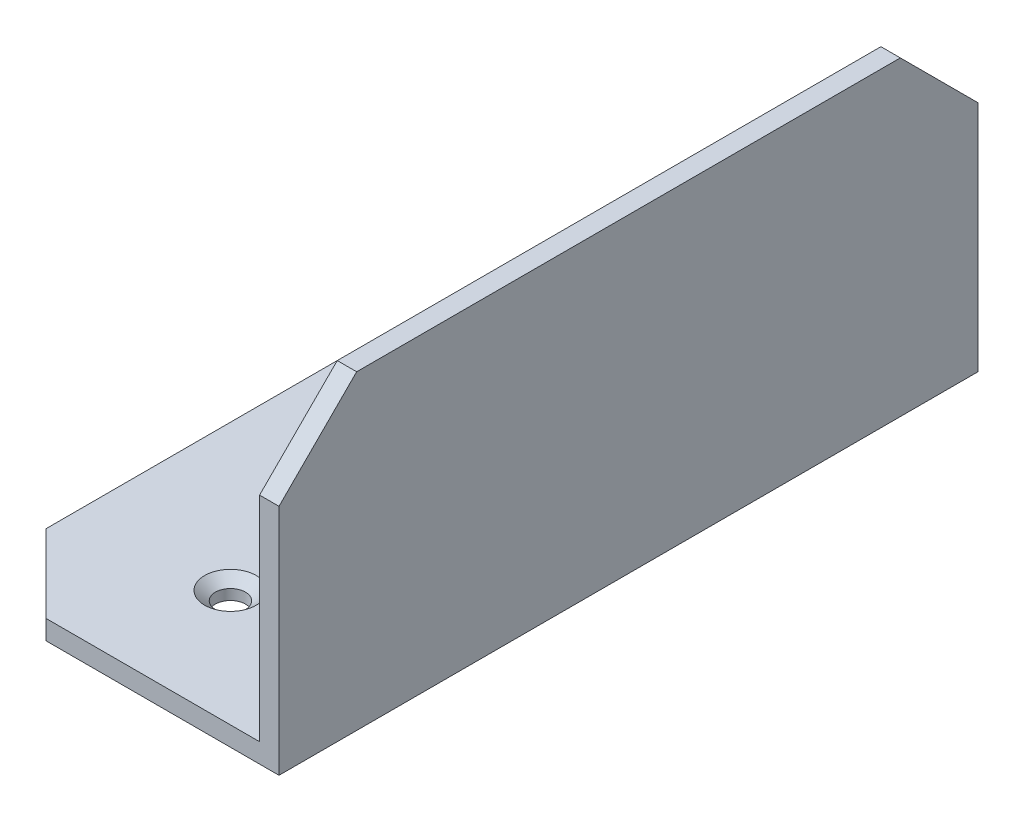
ISO-10303-21;
HEADER;
FILE_DESCRIPTION(('STEP AP214'),'2;1');
FILE_NAME('part.step','',(''),(''),'','','');
FILE_SCHEMA(('AUTOMOTIVE_DESIGN { 1 0 10303 214 1 1 1 1 }'));
ENDSEC;
DATA;
#1=APPLICATION_CONTEXT('core data for automotive mechanical design processes');
#2=APPLICATION_PROTOCOL_DEFINITION('international standard','automotive_design',2000,#1);
#3=PRODUCT_CONTEXT('',#1,'mechanical');
#4=PRODUCT('Part','Part','',(#3));
#5=PRODUCT_RELATED_PRODUCT_CATEGORY('part','',(#4));
#6=PRODUCT_DEFINITION_FORMATION('','',#4);
#7=PRODUCT_DEFINITION_CONTEXT('part definition',#1,'design');
#8=PRODUCT_DEFINITION('design','',#6,#7);
#9=PRODUCT_DEFINITION_SHAPE('','',#8);
#10=(LENGTH_UNIT() NAMED_UNIT(*) SI_UNIT(.MILLI.,.METRE.));
#11=(NAMED_UNIT(*) PLANE_ANGLE_UNIT() SI_UNIT($,.RADIAN.));
#12=(NAMED_UNIT(*) SI_UNIT($,.STERADIAN.) SOLID_ANGLE_UNIT());
#13=UNCERTAINTY_MEASURE_WITH_UNIT(LENGTH_MEASURE(1.E-05),#10,'distance_accuracy_value','');
#14=(GEOMETRIC_REPRESENTATION_CONTEXT(3) GLOBAL_UNCERTAINTY_ASSIGNED_CONTEXT((#13)) GLOBAL_UNIT_ASSIGNED_CONTEXT((#10,
#11,#12)) REPRESENTATION_CONTEXT('',''));
#15=CARTESIAN_POINT('',(0.,0.,0.));
#16=DIRECTION('',(0.,0.,1.));
#17=DIRECTION('',(1.,0.,0.));
#18=AXIS2_PLACEMENT_3D('',#15,#16,#17);
#19=CARTESIAN_POINT('',(0.,0.,-114.3));
#20=DIRECTION('',(0.,-1.,0.));
#21=DIRECTION('',(0.,0.,-1.));
#22=AXIS2_PLACEMENT_3D('',#19,#20,#21);
#23=PLANE('',#22);
#24=CARTESIAN_POINT('',(-26.9875,0.,-19.05));
#25=DIRECTION('',(0.,1.,0.));
#26=DIRECTION('',(0.,0.,1.));
#27=AXIS2_PLACEMENT_3D('',#24,#25,#26);
#28=CIRCLE('',#27,2.45745);
#29=CARTESIAN_POINT('',(-26.9875,0.,-16.59255));
#30=VERTEX_POINT('',#29);
#31=EDGE_CURVE('E385',#30,#30,#28,.T.);
#32=ORIENTED_EDGE('',*,*,#31,.T.);
#33=EDGE_LOOP('',(#32));
#34=FACE_BOUND('',#33,.T.);
#35=CARTESIAN_POINT('',(-26.9875,0.,-57.15));
#36=DIRECTION('',(0.,1.,0.));
#37=DIRECTION('',(0.,0.,1.));
#38=AXIS2_PLACEMENT_3D('',#35,#36,#37);
#39=CIRCLE('',#38,2.45745);
#40=CARTESIAN_POINT('',(-26.9875,0.,-54.69255));
#41=VERTEX_POINT('',#40);
#42=EDGE_CURVE('E395',#41,#41,#39,.T.);
#43=ORIENTED_EDGE('',*,*,#42,.T.);
#44=EDGE_LOOP('',(#43));
#45=FACE_BOUND('',#44,.T.);
#46=CARTESIAN_POINT('',(-26.9875,0.,-95.25));
#47=DIRECTION('',(0.,1.,0.));
#48=DIRECTION('',(0.,0.,1.));
#49=AXIS2_PLACEMENT_3D('',#46,#47,#48);
#50=CIRCLE('',#49,2.45745);
#51=CARTESIAN_POINT('',(-26.9875,0.,-92.79255));
#52=VERTEX_POINT('',#51);
#53=EDGE_CURVE('E150',#52,#52,#50,.T.);
#54=ORIENTED_EDGE('',*,*,#53,.T.);
#55=EDGE_LOOP('',(#54));
#56=FACE_BOUND('',#55,.T.);
#57=DIRECTION('',(0.,0.,1.));
#58=VECTOR('',#57,1.);
#59=CARTESIAN_POINT('',(-50.8,0.,-114.3));
#60=LINE('',#59,#58);
#61=CARTESIAN_POINT('',(-50.8,0.,-101.6));
#62=VERTEX_POINT('',#61);
#63=CARTESIAN_POINT('',(-50.8,0.,-12.7000000000001));
#64=VERTEX_POINT('',#63);
#65=EDGE_CURVE('E156',#62,#64,#60,.T.);
#66=ORIENTED_EDGE('',*,*,#65,.F.);
#67=DIRECTION('',(-0.707106781186549,0.,0.707106781186546));
#68=VECTOR('',#67,1.);
#69=CARTESIAN_POINT('',(-19.0499999999999,0.,-133.35));
#70=LINE('',#69,#68);
#71=CARTESIAN_POINT('',(-38.0999999999999,0.,-114.3));
#72=VERTEX_POINT('',#71);
#73=EDGE_CURVE('E123',#62,#72,#70,.F.);
#74=ORIENTED_EDGE('',*,*,#73,.T.);
#75=DIRECTION('',(1.,0.,0.));
#76=VECTOR('',#75,1.);
#77=CARTESIAN_POINT('',(0.,0.,-114.3));
#78=LINE('',#77,#76);
#79=CARTESIAN_POINT('',(0.,0.,-114.3));
#80=VERTEX_POINT('',#79);
#81=EDGE_CURVE('E118',#72,#80,#78,.T.);
#82=ORIENTED_EDGE('',*,*,#81,.T.);
#83=DIRECTION('',(0.,0.,1.));
#84=VECTOR('',#83,1.);
#85=CARTESIAN_POINT('',(0.,0.,-114.3));
#86=LINE('',#85,#84);
#87=CARTESIAN_POINT('',(0.,0.,0.));
#88=VERTEX_POINT('',#87);
#89=EDGE_CURVE('E122',#80,#88,#86,.T.);
#90=ORIENTED_EDGE('',*,*,#89,.T.);
#91=DIRECTION('',(1.,0.,0.));
#92=VECTOR('',#91,1.);
#93=CARTESIAN_POINT('',(0.,0.,0.));
#94=LINE('',#93,#92);
#95=CARTESIAN_POINT('',(-38.1,0.,0.));
#96=VERTEX_POINT('',#95);
#97=EDGE_CURVE('E148',#96,#88,#94,.T.);
#98=ORIENTED_EDGE('',*,*,#97,.F.);
#99=DIRECTION('',(-0.707106781186546,0.,-0.707106781186549));
#100=VECTOR('',#99,1.);
#101=CARTESIAN_POINT('',(-76.2000000000001,0.,-38.1000000000002));
#102=LINE('',#101,#100);
#103=EDGE_CURVE('E174',#96,#64,#102,.T.);
#104=ORIENTED_EDGE('',*,*,#103,.T.);
#105=EDGE_LOOP('',(#66,#74,#82,#90,#98,#104));
#106=FACE_BOUND('',#105,.T.);
#107=ADVANCED_FACE('F38',(#34,#45,#56,#106),#23,.T.);
#108=CARTESIAN_POINT('',(-50.8,0.,-114.3));
#109=DIRECTION('',(-1.,0.,0.));
#110=DIRECTION('',(0.,0.,1.));
#111=AXIS2_PLACEMENT_3D('',#108,#109,#110);
#112=PLANE('',#111);
#113=DIRECTION('',(0.,0.,1.));
#114=VECTOR('',#113,1.);
#115=CARTESIAN_POINT('',(-50.8,3.175,-114.3));
#116=LINE('',#115,#114);
#117=CARTESIAN_POINT('',(-50.8,3.175,-101.6));
#118=VERTEX_POINT('',#117);
#119=CARTESIAN_POINT('',(-50.8,3.175,-12.7000000000001));
#120=VERTEX_POINT('',#119);
#121=EDGE_CURVE('E160',#118,#120,#116,.T.);
#122=ORIENTED_EDGE('',*,*,#121,.F.);
#123=DIRECTION('',(0.,-1.,0.));
#124=VECTOR('',#123,1.);
#125=CARTESIAN_POINT('',(-50.8,0.,-101.6));
#126=LINE('',#125,#124);
#127=EDGE_CURVE('E171',#118,#62,#126,.T.);
#128=ORIENTED_EDGE('',*,*,#127,.T.);
#129=ORIENTED_EDGE('',*,*,#65,.T.);
#130=DIRECTION('',(0.,1.,0.));
#131=VECTOR('',#130,1.);
#132=CARTESIAN_POINT('',(-50.8,3.175,-12.7000000000001));
#133=LINE('',#132,#131);
#134=EDGE_CURVE('E159',#64,#120,#133,.T.);
#135=ORIENTED_EDGE('',*,*,#134,.T.);
#136=EDGE_LOOP('',(#122,#128,#129,#135));
#137=FACE_BOUND('',#136,.T.);
#138=ADVANCED_FACE('F204',(#137),#112,.T.);
#139=CARTESIAN_POINT('',(-3.175,3.175,-114.3));
#140=DIRECTION('',(0.,1.,0.));
#141=DIRECTION('',(0.,0.,1.));
#142=AXIS2_PLACEMENT_3D('',#139,#140,#141);
#143=PLANE('',#142);
#144=CARTESIAN_POINT('',(-26.9875,3.175,-19.05));
#145=DIRECTION('',(0.,1.,0.));
#146=DIRECTION('',(0.,0.,1.));
#147=AXIS2_PLACEMENT_3D('',#144,#145,#146);
#148=CIRCLE('',#147,4.2164);
#149=CARTESIAN_POINT('',(-26.9875,3.175,-14.8336));
#150=VERTEX_POINT('',#149);
#151=EDGE_CURVE('E383',#150,#150,#148,.T.);
#152=ORIENTED_EDGE('',*,*,#151,.F.);
#153=EDGE_LOOP('',(#152));
#154=FACE_BOUND('',#153,.T.);
#155=CARTESIAN_POINT('',(-26.9875,3.175,-57.15));
#156=DIRECTION('',(0.,1.,0.));
#157=DIRECTION('',(0.,0.,1.));
#158=AXIS2_PLACEMENT_3D('',#155,#156,#157);
#159=CIRCLE('',#158,4.2164);
#160=CARTESIAN_POINT('',(-26.9875,3.175,-52.9336));
#161=VERTEX_POINT('',#160);
#162=EDGE_CURVE('E389',#161,#161,#159,.T.);
#163=ORIENTED_EDGE('',*,*,#162,.F.);
#164=EDGE_LOOP('',(#163));
#165=FACE_BOUND('',#164,.T.);
#166=CARTESIAN_POINT('',(-26.9875,3.175,-95.25));
#167=DIRECTION('',(0.,1.,0.));
#168=DIRECTION('',(0.,0.,1.));
#169=AXIS2_PLACEMENT_3D('',#166,#167,#168);
#170=CIRCLE('',#169,4.2164);
#171=CARTESIAN_POINT('',(-26.9875,3.175,-91.0336));
#172=VERTEX_POINT('',#171);
#173=EDGE_CURVE('E398',#172,#172,#170,.T.);
#174=ORIENTED_EDGE('',*,*,#173,.F.);
#175=EDGE_LOOP('',(#174));
#176=FACE_BOUND('',#175,.T.);
#177=DIRECTION('',(-1.,0.,0.));
#178=VECTOR('',#177,1.);
#179=CARTESIAN_POINT('',(-3.175,3.175,-114.3));
#180=LINE('',#179,#178);
#181=CARTESIAN_POINT('',(-3.175,3.175,-114.3));
#182=VERTEX_POINT('',#181);
#183=CARTESIAN_POINT('',(-38.0999999999999,3.175,-114.3));
#184=VERTEX_POINT('',#183);
#185=EDGE_CURVE('E135',#182,#184,#180,.T.);
#186=ORIENTED_EDGE('',*,*,#185,.T.);
#187=DIRECTION('',(0.707106781186549,0.,-0.707106781186546));
#188=VECTOR('',#187,1.);
#189=CARTESIAN_POINT('',(-20.6374999999999,3.175,-131.7625));
#190=LINE('',#189,#188);
#191=EDGE_CURVE('E182',#184,#118,#190,.F.);
#192=ORIENTED_EDGE('',*,*,#191,.T.);
#193=ORIENTED_EDGE('',*,*,#121,.T.);
#194=DIRECTION('',(0.707106781186546,0.,0.707106781186549));
#195=VECTOR('',#194,1.);
#196=CARTESIAN_POINT('',(-77.7875000000001,3.175,-39.6875000000002));
#197=LINE('',#196,#195);
#198=CARTESIAN_POINT('',(-38.1,3.175,0.));
#199=VERTEX_POINT('',#198);
#200=EDGE_CURVE('E180',#120,#199,#197,.T.);
#201=ORIENTED_EDGE('',*,*,#200,.T.);
#202=DIRECTION('',(-1.,0.,0.));
#203=VECTOR('',#202,1.);
#204=CARTESIAN_POINT('',(-3.175,3.175,0.));
#205=LINE('',#204,#203);
#206=CARTESIAN_POINT('',(-3.175,3.175,0.));
#207=VERTEX_POINT('',#206);
#208=EDGE_CURVE('E128',#207,#199,#205,.T.);
#209=ORIENTED_EDGE('',*,*,#208,.F.);
#210=DIRECTION('',(0.,0.,1.));
#211=VECTOR('',#210,1.);
#212=CARTESIAN_POINT('',(-3.175,3.175,-114.3));
#213=LINE('',#212,#211);
#214=EDGE_CURVE('E163',#182,#207,#213,.T.);
#215=ORIENTED_EDGE('',*,*,#214,.F.);
#216=EDGE_LOOP('',(#186,#192,#193,#201,#209,#215));
#217=FACE_BOUND('',#216,.T.);
#218=ADVANCED_FACE('F207',(#154,#165,#176,#217),#143,.T.);
#219=CARTESIAN_POINT('',(-3.175,3.175,-114.3));
#220=DIRECTION('',(-1.,0.,0.));
#221=DIRECTION('',(0.,0.,1.));
#222=AXIS2_PLACEMENT_3D('',#219,#220,#221);
#223=PLANE('',#222);
#224=DIRECTION('',(0.,0.,1.));
#225=VECTOR('',#224,1.);
#226=CARTESIAN_POINT('',(-3.175,50.8,-114.3));
#227=LINE('',#226,#225);
#228=CARTESIAN_POINT('',(-3.175,50.8,-101.6));
#229=VERTEX_POINT('',#228);
#230=CARTESIAN_POINT('',(-3.175,50.8,-12.7000000000001));
#231=VERTEX_POINT('',#230);
#232=EDGE_CURVE('E166',#229,#231,#227,.T.);
#233=ORIENTED_EDGE('',*,*,#232,.F.);
#234=DIRECTION('',(0.,0.707106781186549,0.707106781186546));
#235=VECTOR('',#234,1.);
#236=CARTESIAN_POINT('',(-3.175,20.6374999999999,-131.7625));
#237=LINE('',#236,#235);
#238=CARTESIAN_POINT('',(-3.175,38.0999999999999,-114.3));
#239=VERTEX_POINT('',#238);
#240=EDGE_CURVE('E190',#229,#239,#237,.F.);
#241=ORIENTED_EDGE('',*,*,#240,.T.);
#242=DIRECTION('',(0.,-1.,0.));
#243=VECTOR('',#242,1.);
#244=CARTESIAN_POINT('',(-3.175,3.175,-114.3));
#245=LINE('',#244,#243);
#246=EDGE_CURVE('E141',#239,#182,#245,.T.);
#247=ORIENTED_EDGE('',*,*,#246,.T.);
#248=ORIENTED_EDGE('',*,*,#214,.T.);
#249=DIRECTION('',(0.,-1.,0.));
#250=VECTOR('',#249,1.);
#251=CARTESIAN_POINT('',(-3.175,3.175,0.));
#252=LINE('',#251,#250);
#253=CARTESIAN_POINT('',(-3.175,38.1,0.));
#254=VERTEX_POINT('',#253);
#255=EDGE_CURVE('E152',#254,#207,#252,.T.);
#256=ORIENTED_EDGE('',*,*,#255,.F.);
#257=DIRECTION('',(0.,0.707106781186546,-0.707106781186549));
#258=VECTOR('',#257,1.);
#259=CARTESIAN_POINT('',(-3.175,77.7875000000001,-39.6875000000002));
#260=LINE('',#259,#258);
#261=EDGE_CURVE('E62',#254,#231,#260,.T.);
#262=ORIENTED_EDGE('',*,*,#261,.T.);
#263=EDGE_LOOP('',(#233,#241,#247,#248,#256,#262));
#264=FACE_BOUND('',#263,.T.);
#265=ADVANCED_FACE('F216',(#264),#223,.T.);
#266=CARTESIAN_POINT('',(0.,50.8,-114.3));
#267=DIRECTION('',(0.,1.,0.));
#268=DIRECTION('',(0.,0.,1.));
#269=AXIS2_PLACEMENT_3D('',#266,#267,#268);
#270=PLANE('',#269);
#271=DIRECTION('',(0.,0.,1.));
#272=VECTOR('',#271,1.);
#273=CARTESIAN_POINT('',(0.,50.8,-114.3));
#274=LINE('',#273,#272);
#275=CARTESIAN_POINT('',(0.,50.8,-101.6));
#276=VERTEX_POINT('',#275);
#277=CARTESIAN_POINT('',(0.,50.8,-12.7000000000001));
#278=VERTEX_POINT('',#277);
#279=EDGE_CURVE('E134',#276,#278,#274,.T.);
#280=ORIENTED_EDGE('',*,*,#279,.F.);
#281=DIRECTION('',(-1.,0.,0.));
#282=VECTOR('',#281,1.);
#283=CARTESIAN_POINT('',(0.,50.8,-101.6));
#284=LINE('',#283,#282);
#285=EDGE_CURVE('E186',#276,#229,#284,.T.);
#286=ORIENTED_EDGE('',*,*,#285,.T.);
#287=ORIENTED_EDGE('',*,*,#232,.T.);
#288=DIRECTION('',(1.,0.,0.));
#289=VECTOR('',#288,1.);
#290=CARTESIAN_POINT('',(0.,50.8,-12.7000000000001));
#291=LINE('',#290,#289);
#292=EDGE_CURVE('E184',#231,#278,#291,.T.);
#293=ORIENTED_EDGE('',*,*,#292,.T.);
#294=EDGE_LOOP('',(#280,#286,#287,#293));
#295=FACE_BOUND('',#294,.T.);
#296=ADVANCED_FACE('F222',(#295),#270,.T.);
#297=CARTESIAN_POINT('',(0.,0.,-114.3));
#298=DIRECTION('',(1.,0.,0.));
#299=DIRECTION('',(0.,1.,0.));
#300=AXIS2_PLACEMENT_3D('',#297,#298,#299);
#301=PLANE('',#300);
#302=DIRECTION('',(0.,1.,0.));
#303=VECTOR('',#302,1.);
#304=CARTESIAN_POINT('',(0.,0.,-114.3));
#305=LINE('',#304,#303);
#306=CARTESIAN_POINT('',(0.,38.0999999999999,-114.3));
#307=VERTEX_POINT('',#306);
#308=EDGE_CURVE('E127',#80,#307,#305,.T.);
#309=ORIENTED_EDGE('',*,*,#308,.T.);
#310=DIRECTION('',(0.,-0.707106781186549,-0.707106781186546));
#311=VECTOR('',#310,1.);
#312=CARTESIAN_POINT('',(0.,19.0499999999999,-133.35));
#313=LINE('',#312,#311);
#314=EDGE_CURVE('E193',#307,#276,#313,.F.);
#315=ORIENTED_EDGE('',*,*,#314,.T.);
#316=ORIENTED_EDGE('',*,*,#279,.T.);
#317=DIRECTION('',(0.,-0.707106781186546,0.707106781186549));
#318=VECTOR('',#317,1.);
#319=CARTESIAN_POINT('',(0.,76.2000000000001,-38.1000000000002));
#320=LINE('',#319,#318);
#321=CARTESIAN_POINT('',(0.,38.1,0.));
#322=VERTEX_POINT('',#321);
#323=EDGE_CURVE('E54',#278,#322,#320,.T.);
#324=ORIENTED_EDGE('',*,*,#323,.T.);
#325=DIRECTION('',(0.,1.,0.));
#326=VECTOR('',#325,1.);
#327=CARTESIAN_POINT('',(0.,0.,0.));
#328=LINE('',#327,#326);
#329=EDGE_CURVE('E133',#88,#322,#328,.T.);
#330=ORIENTED_EDGE('',*,*,#329,.F.);
#331=ORIENTED_EDGE('',*,*,#89,.F.);
#332=EDGE_LOOP('',(#309,#315,#316,#324,#330,#331));
#333=FACE_BOUND('',#332,.T.);
#334=ADVANCED_FACE('F131',(#333),#301,.T.);
#335=CARTESIAN_POINT('',(0.,0.,-114.3));
#336=DIRECTION('',(0.,0.,-1.));
#337=DIRECTION('',(-1.,0.,0.));
#338=AXIS2_PLACEMENT_3D('',#335,#336,#337);
#339=PLANE('',#338);
#340=ORIENTED_EDGE('',*,*,#81,.F.);
#341=DIRECTION('',(0.,1.,0.));
#342=VECTOR('',#341,1.);
#343=CARTESIAN_POINT('',(-38.0999999999999,0.,-114.3));
#344=LINE('',#343,#342);
#345=EDGE_CURVE('E178',#72,#184,#344,.T.);
#346=ORIENTED_EDGE('',*,*,#345,.T.);
#347=ORIENTED_EDGE('',*,*,#185,.F.);
#348=ORIENTED_EDGE('',*,*,#246,.F.);
#349=DIRECTION('',(1.,0.,0.));
#350=VECTOR('',#349,1.);
#351=CARTESIAN_POINT('',(0.,38.0999999999999,-114.3));
#352=LINE('',#351,#350);
#353=EDGE_CURVE('E140',#239,#307,#352,.T.);
#354=ORIENTED_EDGE('',*,*,#353,.T.);
#355=ORIENTED_EDGE('',*,*,#308,.F.);
#356=EDGE_LOOP('',(#340,#346,#347,#348,#354,#355));
#357=FACE_BOUND('',#356,.T.);
#358=ADVANCED_FACE('F137',(#357),#339,.T.);
#359=CARTESIAN_POINT('',(0.,0.,0.));
#360=DIRECTION('',(0.,0.,-1.));
#361=DIRECTION('',(-1.,0.,0.));
#362=AXIS2_PLACEMENT_3D('',#359,#360,#361);
#363=PLANE('',#362);
#364=ORIENTED_EDGE('',*,*,#329,.T.);
#365=DIRECTION('',(-1.,0.,0.));
#366=VECTOR('',#365,1.);
#367=CARTESIAN_POINT('',(-3.175,38.1,0.));
#368=LINE('',#367,#366);
#369=EDGE_CURVE('E11',#322,#254,#368,.T.);
#370=ORIENTED_EDGE('',*,*,#369,.T.);
#371=ORIENTED_EDGE('',*,*,#255,.T.);
#372=ORIENTED_EDGE('',*,*,#208,.T.);
#373=DIRECTION('',(0.,-1.,0.));
#374=VECTOR('',#373,1.);
#375=CARTESIAN_POINT('',(-38.1,0.,0.));
#376=LINE('',#375,#374);
#377=EDGE_CURVE('E47',#199,#96,#376,.T.);
#378=ORIENTED_EDGE('',*,*,#377,.T.);
#379=ORIENTED_EDGE('',*,*,#97,.T.);
#380=EDGE_LOOP('',(#364,#370,#371,#372,#378,#379));
#381=FACE_BOUND('',#380,.T.);
#382=ADVANCED_FACE('F197',(#381),#363,.F.);
#383=CARTESIAN_POINT('',(-50.8,0.,-101.6));
#384=DIRECTION('',(0.707106781186546,0.,0.707106781186549));
#385=DIRECTION('',(0.,-1.,0.));
#386=AXIS2_PLACEMENT_3D('',#383,#384,#385);
#387=PLANE('',#386);
#388=ORIENTED_EDGE('',*,*,#191,.F.);
#389=ORIENTED_EDGE('',*,*,#345,.F.);
#390=ORIENTED_EDGE('',*,*,#73,.F.);
#391=ORIENTED_EDGE('',*,*,#127,.F.);
#392=EDGE_LOOP('',(#388,#389,#390,#391));
#393=FACE_BOUND('',#392,.T.);
#394=ADVANCED_FACE('F211',(#393),#387,.F.);
#395=CARTESIAN_POINT('',(0.,50.8,-101.6));
#396=DIRECTION('',(0.,-0.707106781186546,0.707106781186549));
#397=DIRECTION('',(-1.,0.,0.));
#398=AXIS2_PLACEMENT_3D('',#395,#396,#397);
#399=PLANE('',#398);
#400=ORIENTED_EDGE('',*,*,#314,.F.);
#401=ORIENTED_EDGE('',*,*,#353,.F.);
#402=ORIENTED_EDGE('',*,*,#240,.F.);
#403=ORIENTED_EDGE('',*,*,#285,.F.);
#404=EDGE_LOOP('',(#400,#401,#402,#403));
#405=FACE_BOUND('',#404,.T.);
#406=ADVANCED_FACE('F218',(#405),#399,.F.);
#407=CARTESIAN_POINT('',(0.,38.1,0.));
#408=DIRECTION('',(0.,0.707106781186549,0.707106781186546));
#409=DIRECTION('',(1.,0.,0.));
#410=AXIS2_PLACEMENT_3D('',#407,#408,#409);
#411=PLANE('',#410);
#412=ORIENTED_EDGE('',*,*,#323,.F.);
#413=ORIENTED_EDGE('',*,*,#292,.F.);
#414=ORIENTED_EDGE('',*,*,#261,.F.);
#415=ORIENTED_EDGE('',*,*,#369,.F.);
#416=EDGE_LOOP('',(#412,#413,#414,#415));
#417=FACE_BOUND('',#416,.T.);
#418=ADVANCED_FACE('F223',(#417),#411,.T.);
#419=CARTESIAN_POINT('',(-38.1,0.,0.));
#420=DIRECTION('',(-0.707106781186549,0.,0.707106781186546));
#421=DIRECTION('',(0.,1.,0.));
#422=AXIS2_PLACEMENT_3D('',#419,#420,#421);
#423=PLANE('',#422);
#424=ORIENTED_EDGE('',*,*,#200,.F.);
#425=ORIENTED_EDGE('',*,*,#134,.F.);
#426=ORIENTED_EDGE('',*,*,#103,.F.);
#427=ORIENTED_EDGE('',*,*,#377,.F.);
#428=EDGE_LOOP('',(#424,#425,#426,#427));
#429=FACE_BOUND('',#428,.T.);
#430=ADVANCED_FACE('F41',(#429),#423,.T.);
#431=CARTESIAN_POINT('',(-26.9875,3.175,-95.25));
#432=DIRECTION('',(0.,1.,0.));
#433=DIRECTION('',(0.,0.,1.));
#434=AXIS2_PLACEMENT_3D('',#431,#432,#433);
#435=CYLINDRICAL_SURFACE('',#434,2.45745);
#436=ORIENTED_EDGE('',*,*,#53,.F.);
#437=EDGE_LOOP('',(#436));
#438=FACE_BOUND('',#437,.T.);
#439=CARTESIAN_POINT('',(-26.9875,1.69906570374072,-95.25));
#440=DIRECTION('',(0.,1.,0.));
#441=DIRECTION('',(0.,0.,1.));
#442=AXIS2_PLACEMENT_3D('',#439,#440,#441);
#443=CIRCLE('',#442,2.45745);
#444=CARTESIAN_POINT('',(-26.9875,1.69906570374072,-92.79255));
#445=VERTEX_POINT('',#444);
#446=EDGE_CURVE('E401',#445,#445,#443,.T.);
#447=ORIENTED_EDGE('',*,*,#446,.T.);
#448=EDGE_LOOP('',(#447));
#449=FACE_BOUND('',#448,.T.);
#450=ADVANCED_FACE('F229',(#438,#449),#435,.F.);
#451=CARTESIAN_POINT('',(-26.9875,3.175,-95.25));
#452=DIRECTION('',(0.,1.,0.));
#453=DIRECTION('',(0.,0.,1.));
#454=AXIS2_PLACEMENT_3D('',#451,#452,#453);
#455=CONICAL_SURFACE('',#454,4.2164,0.872664625997164);
#456=ORIENTED_EDGE('',*,*,#446,.F.);
#457=EDGE_LOOP('',(#456));
#458=FACE_BOUND('',#457,.T.);
#459=ORIENTED_EDGE('',*,*,#173,.T.);
#460=EDGE_LOOP('',(#459));
#461=FACE_BOUND('',#460,.T.);
#462=ADVANCED_FACE('F324',(#458,#461),#455,.F.);
#463=CARTESIAN_POINT('',(-26.9875,3.175,-57.15));
#464=DIRECTION('',(0.,1.,0.));
#465=DIRECTION('',(0.,0.,1.));
#466=AXIS2_PLACEMENT_3D('',#463,#464,#465);
#467=CYLINDRICAL_SURFACE('',#466,2.45745);
#468=ORIENTED_EDGE('',*,*,#42,.F.);
#469=EDGE_LOOP('',(#468));
#470=FACE_BOUND('',#469,.T.);
#471=CARTESIAN_POINT('',(-26.9875,1.69906570374072,-57.15));
#472=DIRECTION('',(0.,1.,0.));
#473=DIRECTION('',(0.,0.,1.));
#474=AXIS2_PLACEMENT_3D('',#471,#472,#473);
#475=CIRCLE('',#474,2.45745);
#476=CARTESIAN_POINT('',(-26.9875,1.69906570374072,-54.69255));
#477=VERTEX_POINT('',#476);
#478=EDGE_CURVE('E392',#477,#477,#475,.T.);
#479=ORIENTED_EDGE('',*,*,#478,.T.);
#480=EDGE_LOOP('',(#479));
#481=FACE_BOUND('',#480,.T.);
#482=ADVANCED_FACE('F333',(#470,#481),#467,.F.);
#483=CARTESIAN_POINT('',(-26.9875,3.175,-57.15));
#484=DIRECTION('',(0.,1.,0.));
#485=DIRECTION('',(0.,0.,1.));
#486=AXIS2_PLACEMENT_3D('',#483,#484,#485);
#487=CONICAL_SURFACE('',#486,4.2164,0.872664625997164);
#488=ORIENTED_EDGE('',*,*,#478,.F.);
#489=EDGE_LOOP('',(#488));
#490=FACE_BOUND('',#489,.T.);
#491=ORIENTED_EDGE('',*,*,#162,.T.);
#492=EDGE_LOOP('',(#491));
#493=FACE_BOUND('',#492,.T.);
#494=ADVANCED_FACE('F343',(#490,#493),#487,.F.);
#495=CARTESIAN_POINT('',(-26.9875,3.175,-19.05));
#496=DIRECTION('',(0.,1.,0.));
#497=DIRECTION('',(0.,0.,1.));
#498=AXIS2_PLACEMENT_3D('',#495,#496,#497);
#499=CYLINDRICAL_SURFACE('',#498,2.45745);
#500=ORIENTED_EDGE('',*,*,#31,.F.);
#501=EDGE_LOOP('',(#500));
#502=FACE_BOUND('',#501,.T.);
#503=CARTESIAN_POINT('',(-26.9875,1.69906570374072,-19.05));
#504=DIRECTION('',(0.,1.,0.));
#505=DIRECTION('',(0.,0.,1.));
#506=AXIS2_PLACEMENT_3D('',#503,#504,#505);
#507=CIRCLE('',#506,2.45745);
#508=CARTESIAN_POINT('',(-26.9875,1.69906570374072,-16.59255));
#509=VERTEX_POINT('',#508);
#510=EDGE_CURVE('E380',#509,#509,#507,.T.);
#511=ORIENTED_EDGE('',*,*,#510,.T.);
#512=EDGE_LOOP('',(#511));
#513=FACE_BOUND('',#512,.T.);
#514=ADVANCED_FACE('F353',(#502,#513),#499,.F.);
#515=CARTESIAN_POINT('',(-26.9875,3.175,-19.05));
#516=DIRECTION('',(0.,1.,0.));
#517=DIRECTION('',(0.,0.,1.));
#518=AXIS2_PLACEMENT_3D('',#515,#516,#517);
#519=CONICAL_SURFACE('',#518,4.2164,0.872664625997164);
#520=ORIENTED_EDGE('',*,*,#510,.F.);
#521=EDGE_LOOP('',(#520));
#522=FACE_BOUND('',#521,.T.);
#523=ORIENTED_EDGE('',*,*,#151,.T.);
#524=EDGE_LOOP('',(#523));
#525=FACE_BOUND('',#524,.T.);
#526=ADVANCED_FACE('F363',(#522,#525),#519,.F.);
#527=CLOSED_SHELL('',(#107,#138,#218,#265,#296,#334,#358,#382,#394,#406,#418,#430,#450,#462,
#482,#494,#514,#526));
#528=MANIFOLD_SOLID_BREP('B2',#527);
#529=ADVANCED_BREP_SHAPE_REPRESENTATION('',(#18,#528),#14);
#530=SHAPE_DEFINITION_REPRESENTATION(#9,#529);
ENDSEC;
END-ISO-10303-21;
